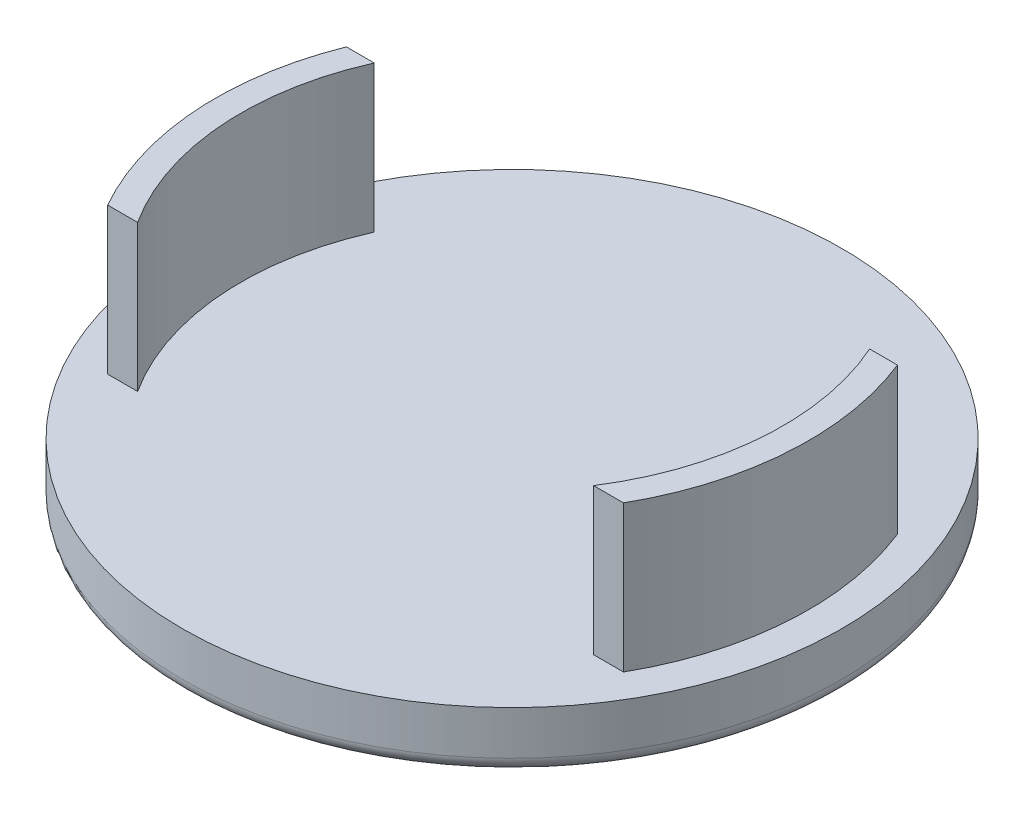
ISO-10303-21;
HEADER;
FILE_DESCRIPTION(('STEP AP214'),'2;1');
FILE_NAME('part.step','',(''),(''),'','','');
FILE_SCHEMA(('AUTOMOTIVE_DESIGN { 1 0 10303 214 1 1 1 1 }'));
ENDSEC;
DATA;
#1=APPLICATION_CONTEXT('core data for automotive mechanical design processes');
#2=APPLICATION_PROTOCOL_DEFINITION('international standard','automotive_design',2000,#1);
#3=PRODUCT_CONTEXT('',#1,'mechanical');
#4=PRODUCT('Part','Part','',(#3));
#5=PRODUCT_RELATED_PRODUCT_CATEGORY('part','',(#4));
#6=PRODUCT_DEFINITION_FORMATION('','',#4);
#7=PRODUCT_DEFINITION_CONTEXT('part definition',#1,'design');
#8=PRODUCT_DEFINITION('design','',#6,#7);
#9=PRODUCT_DEFINITION_SHAPE('','',#8);
#10=(LENGTH_UNIT() NAMED_UNIT(*) SI_UNIT(.MILLI.,.METRE.));
#11=(NAMED_UNIT(*) PLANE_ANGLE_UNIT() SI_UNIT($,.RADIAN.));
#12=(NAMED_UNIT(*) SI_UNIT($,.STERADIAN.) SOLID_ANGLE_UNIT());
#13=UNCERTAINTY_MEASURE_WITH_UNIT(LENGTH_MEASURE(1.E-05),#10,'distance_accuracy_value','');
#14=(GEOMETRIC_REPRESENTATION_CONTEXT(3) GLOBAL_UNCERTAINTY_ASSIGNED_CONTEXT((#13)) GLOBAL_UNIT_ASSIGNED_CONTEXT((#10,
#11,#12)) REPRESENTATION_CONTEXT('',''));
#15=CARTESIAN_POINT('',(0.,0.,0.));
#16=DIRECTION('',(0.,0.,1.));
#17=DIRECTION('',(1.,0.,0.));
#18=AXIS2_PLACEMENT_3D('',#15,#16,#17);
#19=CARTESIAN_POINT('',(0.,14.,0.));
#20=DIRECTION('',(0.,1.,0.));
#21=DIRECTION('',(0.,0.,1.));
#22=AXIS2_PLACEMENT_3D('',#19,#20,#21);
#23=PLANE('',#22);
#24=DIRECTION('',(1.,0.,0.));
#25=VECTOR('',#24,1.);
#26=CARTESIAN_POINT('',(-24.1851152798793,14.,-7.5));
#27=LINE('',#26,#25);
#28=CARTESIAN_POINT('',(-18.8099043059767,14.,-7.5));
#29=VERTEX_POINT('',#28);
#30=CARTESIAN_POINT('',(-16.9115345252878,14.,-7.5));
#31=VERTEX_POINT('',#30);
#32=EDGE_CURVE('E210',#29,#31,#27,.T.);
#33=ORIENTED_EDGE('',*,*,#32,.F.);
#34=CARTESIAN_POINT('',(0.,14.,0.));
#35=DIRECTION('',(0.,1.,0.));
#36=DIRECTION('',(0.,0.,1.));
#37=AXIS2_PLACEMENT_3D('',#34,#35,#36);
#38=CIRCLE('',#37,20.25);
#39=CARTESIAN_POINT('',(-17.6085916529403,14.,10.));
#40=VERTEX_POINT('',#39);
#41=EDGE_CURVE('E133',#29,#40,#38,.T.);
#42=ORIENTED_EDGE('',*,*,#41,.T.);
#43=DIRECTION('',(-1.,0.,0.));
#44=VECTOR('',#43,1.);
#45=CARTESIAN_POINT('',(-21.2125444705935,14.,10.));
#46=LINE('',#45,#44);
#47=CARTESIAN_POINT('',(-15.5643824162734,14.,10.));
#48=VERTEX_POINT('',#47);
#49=EDGE_CURVE('E127',#48,#40,#46,.T.);
#50=ORIENTED_EDGE('',*,*,#49,.F.);
#51=CARTESIAN_POINT('',(0.,14.,0.));
#52=DIRECTION('',(0.,1.,0.));
#53=DIRECTION('',(0.,0.,1.));
#54=AXIS2_PLACEMENT_3D('',#51,#52,#53);
#55=CIRCLE('',#54,18.5);
#56=EDGE_CURVE('E226',#31,#48,#55,.T.);
#57=ORIENTED_EDGE('',*,*,#56,.F.);
#58=EDGE_LOOP('',(#33,#42,#50,#57));
#59=FACE_BOUND('',#58,.T.);
#60=ADVANCED_FACE('F41',(#59),#23,.T.);
#61=CARTESIAN_POINT('',(0.,14.,0.));
#62=DIRECTION('',(0.,-1.,0.));
#63=DIRECTION('',(0.,0.,-1.));
#64=AXIS2_PLACEMENT_3D('',#61,#62,#63);
#65=CYLINDRICAL_SURFACE('',#64,20.25);
#66=ORIENTED_EDGE('',*,*,#41,.F.);
#67=DIRECTION('',(0.,-1.,0.));
#68=VECTOR('',#67,1.);
#69=CARTESIAN_POINT('',(-18.8099043059767,14.,-7.5));
#70=LINE('',#69,#68);
#71=CARTESIAN_POINT('',(-18.8099043059767,4.,-7.5));
#72=VERTEX_POINT('',#71);
#73=EDGE_CURVE('E224',#29,#72,#70,.T.);
#74=ORIENTED_EDGE('',*,*,#73,.T.);
#75=CARTESIAN_POINT('',(0.,4.,0.));
#76=DIRECTION('',(0.,1.,0.));
#77=DIRECTION('',(0.,0.,1.));
#78=AXIS2_PLACEMENT_3D('',#75,#76,#77);
#79=CIRCLE('',#78,20.25);
#80=CARTESIAN_POINT('',(-17.6085916529403,4.,10.));
#81=VERTEX_POINT('',#80);
#82=EDGE_CURVE('E143',#72,#81,#79,.T.);
#83=ORIENTED_EDGE('',*,*,#82,.T.);
#84=DIRECTION('',(0.,-1.,0.));
#85=VECTOR('',#84,1.);
#86=CARTESIAN_POINT('',(-17.6085916529403,14.,10.));
#87=LINE('',#86,#85);
#88=EDGE_CURVE('E116',#81,#40,#87,.F.);
#89=ORIENTED_EDGE('',*,*,#88,.T.);
#90=EDGE_LOOP('',(#66,#74,#83,#89));
#91=FACE_BOUND('',#90,.T.);
#92=ADVANCED_FACE('F165',(#91),#65,.T.);
#93=CARTESIAN_POINT('',(0.,14.,0.));
#94=DIRECTION('',(0.,-1.,0.));
#95=DIRECTION('',(0.,0.,-1.));
#96=AXIS2_PLACEMENT_3D('',#93,#94,#95);
#97=CYLINDRICAL_SURFACE('',#96,18.5);
#98=DIRECTION('',(0.,-1.,0.));
#99=VECTOR('',#98,1.);
#100=CARTESIAN_POINT('',(-16.9115345252878,14.,-7.5));
#101=LINE('',#100,#99);
#102=CARTESIAN_POINT('',(-16.9115345252878,4.,-7.5));
#103=VERTEX_POINT('',#102);
#104=EDGE_CURVE('E206',#31,#103,#101,.T.);
#105=ORIENTED_EDGE('',*,*,#104,.F.);
#106=ORIENTED_EDGE('',*,*,#56,.T.);
#107=DIRECTION('',(0.,-1.,0.));
#108=VECTOR('',#107,1.);
#109=CARTESIAN_POINT('',(-15.5643824162734,14.,10.));
#110=LINE('',#109,#108);
#111=CARTESIAN_POINT('',(-15.5643824162734,4.,10.));
#112=VERTEX_POINT('',#111);
#113=EDGE_CURVE('E212',#112,#48,#110,.F.);
#114=ORIENTED_EDGE('',*,*,#113,.F.);
#115=CARTESIAN_POINT('',(0.,4.,0.));
#116=DIRECTION('',(0.,1.,0.));
#117=DIRECTION('',(0.,0.,1.));
#118=AXIS2_PLACEMENT_3D('',#115,#116,#117);
#119=CIRCLE('',#118,18.5);
#120=EDGE_CURVE('E145',#112,#103,#119,.F.);
#121=ORIENTED_EDGE('',*,*,#120,.T.);
#122=EDGE_LOOP('',(#105,#106,#114,#121));
#123=FACE_BOUND('',#122,.T.);
#124=ADVANCED_FACE('F171',(#123),#97,.F.);
#125=CARTESIAN_POINT('',(0.,4.,0.));
#126=DIRECTION('',(0.,-1.,0.));
#127=DIRECTION('',(0.,0.,-1.));
#128=AXIS2_PLACEMENT_3D('',#125,#126,#127);
#129=CYLINDRICAL_SURFACE('',#128,22.5);
#130=CARTESIAN_POINT('',(0.,1.,0.));
#131=DIRECTION('',(0.,1.,0.));
#132=DIRECTION('',(0.,0.,1.));
#133=AXIS2_PLACEMENT_3D('',#130,#131,#132);
#134=CIRCLE('',#133,22.5);
#135=CARTESIAN_POINT('',(0.,1.,22.5));
#136=VERTEX_POINT('',#135);
#137=EDGE_CURVE('E49',#136,#136,#134,.T.);
#138=ORIENTED_EDGE('',*,*,#137,.T.);
#139=EDGE_LOOP('',(#138));
#140=FACE_BOUND('',#139,.T.);
#141=CARTESIAN_POINT('',(0.,4.,0.));
#142=DIRECTION('',(0.,1.,0.));
#143=DIRECTION('',(0.,0.,1.));
#144=AXIS2_PLACEMENT_3D('',#141,#142,#143);
#145=CIRCLE('',#144,22.5);
#146=CARTESIAN_POINT('',(0.,4.,22.5));
#147=VERTEX_POINT('',#146);
#148=EDGE_CURVE('E132',#147,#147,#145,.T.);
#149=ORIENTED_EDGE('',*,*,#148,.F.);
#150=EDGE_LOOP('',(#149));
#151=FACE_BOUND('',#150,.T.);
#152=ADVANCED_FACE('F150',(#140,#151),#129,.T.);
#153=CARTESIAN_POINT('',(0.,4.,0.));
#154=DIRECTION('',(0.,1.,0.));
#155=DIRECTION('',(0.,0.,1.));
#156=AXIS2_PLACEMENT_3D('',#153,#154,#155);
#157=PLANE('',#156);
#158=ORIENTED_EDGE('',*,*,#82,.F.);
#159=DIRECTION('',(1.,0.,0.));
#160=VECTOR('',#159,1.);
#161=CARTESIAN_POINT('',(-24.1851152798793,4.,-7.5));
#162=LINE('',#161,#160);
#163=EDGE_CURVE('E64',#72,#103,#162,.T.);
#164=ORIENTED_EDGE('',*,*,#163,.T.);
#165=ORIENTED_EDGE('',*,*,#120,.F.);
#166=DIRECTION('',(-1.,0.,0.));
#167=VECTOR('',#166,1.);
#168=CARTESIAN_POINT('',(-21.2125444705935,4.,10.));
#169=LINE('',#168,#167);
#170=EDGE_CURVE('E215',#112,#81,#169,.T.);
#171=ORIENTED_EDGE('',*,*,#170,.T.);
#172=EDGE_LOOP('',(#158,#164,#165,#171));
#173=FACE_BOUND('',#172,.T.);
#174=ORIENTED_EDGE('',*,*,#148,.T.);
#175=EDGE_LOOP('',(#174));
#176=FACE_BOUND('',#175,.T.);
#177=CARTESIAN_POINT('',(17.6085916529403,4.,10.));
#178=VERTEX_POINT('',#177);
#179=CARTESIAN_POINT('',(18.8099043059767,4.,-7.5));
#180=VERTEX_POINT('',#179);
#181=EDGE_CURVE('E139',#178,#180,#79,.T.);
#182=ORIENTED_EDGE('',*,*,#181,.F.);
#183=CARTESIAN_POINT('',(15.5643824162734,4.,10.));
#184=VERTEX_POINT('',#183);
#185=EDGE_CURVE('E56',#178,#184,#169,.T.);
#186=ORIENTED_EDGE('',*,*,#185,.T.);
#187=CARTESIAN_POINT('',(16.9115345252878,4.,-7.5));
#188=VERTEX_POINT('',#187);
#189=EDGE_CURVE('E136',#188,#184,#119,.F.);
#190=ORIENTED_EDGE('',*,*,#189,.F.);
#191=EDGE_CURVE('E209',#188,#180,#162,.T.);
#192=ORIENTED_EDGE('',*,*,#191,.T.);
#193=EDGE_LOOP('',(#182,#186,#190,#192));
#194=FACE_BOUND('',#193,.T.);
#195=ADVANCED_FACE('F183',(#173,#176,#194),#157,.T.);
#196=CARTESIAN_POINT('',(0.,0.,0.));
#197=DIRECTION('',(0.,1.,0.));
#198=DIRECTION('',(0.,0.,1.));
#199=AXIS2_PLACEMENT_3D('',#196,#197,#198);
#200=PLANE('',#199);
#201=CARTESIAN_POINT('',(0.,0.,0.));
#202=DIRECTION('',(0.,1.,0.));
#203=DIRECTION('',(0.,0.,1.));
#204=AXIS2_PLACEMENT_3D('',#201,#202,#203);
#205=CIRCLE('',#204,21.5);
#206=CARTESIAN_POINT('',(0.,0.,21.5));
#207=VERTEX_POINT('',#206);
#208=EDGE_CURVE('E11',#207,#207,#205,.F.);
#209=ORIENTED_EDGE('',*,*,#208,.T.);
#210=EDGE_LOOP('',(#209));
#211=FACE_BOUND('',#210,.T.);
#212=ADVANCED_FACE('F177',(#211),#200,.F.);
#213=CARTESIAN_POINT('',(16.9115345252878,14.,-7.5));
#214=VERTEX_POINT('',#213);
#215=CARTESIAN_POINT('',(18.8099043059767,14.,-7.5));
#216=VERTEX_POINT('',#215);
#217=EDGE_CURVE('E126',#214,#216,#27,.T.);
#218=ORIENTED_EDGE('',*,*,#217,.F.);
#219=CARTESIAN_POINT('',(15.5643824162734,14.,10.));
#220=VERTEX_POINT('',#219);
#221=EDGE_CURVE('E125',#220,#214,#55,.T.);
#222=ORIENTED_EDGE('',*,*,#221,.F.);
#223=CARTESIAN_POINT('',(17.6085916529403,14.,10.));
#224=VERTEX_POINT('',#223);
#225=EDGE_CURVE('E110',#224,#220,#46,.T.);
#226=ORIENTED_EDGE('',*,*,#225,.F.);
#227=EDGE_CURVE('E123',#224,#216,#38,.T.);
#228=ORIENTED_EDGE('',*,*,#227,.T.);
#229=EDGE_LOOP('',(#218,#222,#226,#228));
#230=FACE_BOUND('',#229,.T.);
#231=ADVANCED_FACE('F122',(#230),#23,.T.);
#232=ORIENTED_EDGE('',*,*,#181,.T.);
#233=DIRECTION('',(0.,-1.,0.));
#234=VECTOR('',#233,1.);
#235=CARTESIAN_POINT('',(18.8099043059767,14.,-7.5));
#236=LINE('',#235,#234);
#237=EDGE_CURVE('E131',#180,#216,#236,.F.);
#238=ORIENTED_EDGE('',*,*,#237,.T.);
#239=ORIENTED_EDGE('',*,*,#227,.F.);
#240=DIRECTION('',(0.,-1.,0.));
#241=VECTOR('',#240,1.);
#242=CARTESIAN_POINT('',(17.6085916529403,14.,10.));
#243=LINE('',#242,#241);
#244=EDGE_CURVE('E107',#224,#178,#243,.T.);
#245=ORIENTED_EDGE('',*,*,#244,.T.);
#246=EDGE_LOOP('',(#232,#238,#239,#245));
#247=FACE_BOUND('',#246,.T.);
#248=ADVANCED_FACE('F130',(#247),#65,.T.);
#249=DIRECTION('',(0.,-1.,0.));
#250=VECTOR('',#249,1.);
#251=CARTESIAN_POINT('',(16.9115345252878,14.,-7.5));
#252=LINE('',#251,#250);
#253=EDGE_CURVE('E115',#188,#214,#252,.F.);
#254=ORIENTED_EDGE('',*,*,#253,.F.);
#255=ORIENTED_EDGE('',*,*,#189,.T.);
#256=DIRECTION('',(0.,-1.,0.));
#257=VECTOR('',#256,1.);
#258=CARTESIAN_POINT('',(15.5643824162734,14.,10.));
#259=LINE('',#258,#257);
#260=EDGE_CURVE('E219',#220,#184,#259,.T.);
#261=ORIENTED_EDGE('',*,*,#260,.F.);
#262=ORIENTED_EDGE('',*,*,#221,.T.);
#263=EDGE_LOOP('',(#254,#255,#261,#262));
#264=FACE_BOUND('',#263,.T.);
#265=ADVANCED_FACE('F182',(#264),#97,.F.);
#266=CARTESIAN_POINT('',(-21.2125444705935,4.,10.));
#267=DIRECTION('',(0.,0.,-1.));
#268=DIRECTION('',(-1.,0.,0.));
#269=AXIS2_PLACEMENT_3D('',#266,#267,#268);
#270=PLANE('',#269);
#271=ORIENTED_EDGE('',*,*,#225,.T.);
#272=ORIENTED_EDGE('',*,*,#260,.T.);
#273=ORIENTED_EDGE('',*,*,#185,.F.);
#274=ORIENTED_EDGE('',*,*,#244,.F.);
#275=EDGE_LOOP('',(#271,#272,#273,#274));
#276=FACE_BOUND('',#275,.T.);
#277=ADVANCED_FACE('F109',(#276),#270,.F.);
#278=ORIENTED_EDGE('',*,*,#170,.F.);
#279=ORIENTED_EDGE('',*,*,#113,.T.);
#280=ORIENTED_EDGE('',*,*,#49,.T.);
#281=ORIENTED_EDGE('',*,*,#88,.F.);
#282=EDGE_LOOP('',(#278,#279,#280,#281));
#283=FACE_BOUND('',#282,.T.);
#284=ADVANCED_FACE('F203',(#283),#270,.F.);
#285=CARTESIAN_POINT('',(-24.1851152798793,4.,-7.5));
#286=DIRECTION('',(0.,0.,1.));
#287=DIRECTION('',(1.,0.,0.));
#288=AXIS2_PLACEMENT_3D('',#285,#286,#287);
#289=PLANE('',#288);
#290=ORIENTED_EDGE('',*,*,#32,.T.);
#291=ORIENTED_EDGE('',*,*,#104,.T.);
#292=ORIENTED_EDGE('',*,*,#163,.F.);
#293=ORIENTED_EDGE('',*,*,#73,.F.);
#294=EDGE_LOOP('',(#290,#291,#292,#293));
#295=FACE_BOUND('',#294,.T.);
#296=ADVANCED_FACE('F160',(#295),#289,.F.);
#297=ORIENTED_EDGE('',*,*,#191,.F.);
#298=ORIENTED_EDGE('',*,*,#253,.T.);
#299=ORIENTED_EDGE('',*,*,#217,.T.);
#300=ORIENTED_EDGE('',*,*,#237,.F.);
#301=EDGE_LOOP('',(#297,#298,#299,#300));
#302=FACE_BOUND('',#301,.T.);
#303=ADVANCED_FACE('F154',(#302),#289,.F.);
#304=CARTESIAN_POINT('',(0.,1.,0.));
#305=DIRECTION('',(0.,1.,0.));
#306=DIRECTION('',(0.,0.,1.));
#307=AXIS2_PLACEMENT_3D('',#304,#305,#306);
#308=TOROIDAL_SURFACE('',#307,21.5,1.);
#309=ORIENTED_EDGE('',*,*,#208,.F.);
#310=EDGE_LOOP('',(#309));
#311=FACE_BOUND('',#310,.T.);
#312=ORIENTED_EDGE('',*,*,#137,.F.);
#313=EDGE_LOOP('',(#312));
#314=FACE_BOUND('',#313,.T.);
#315=ADVANCED_FACE('F43',(#311,#314),#308,.T.);
#316=CLOSED_SHELL('',(#60,#92,#124,#152,#195,#212,#231,#248,#265,#277,#284,#296,#303,#315));
#317=MANIFOLD_SOLID_BREP('B2',#316);
#318=ADVANCED_BREP_SHAPE_REPRESENTATION('',(#18,#317),#14);
#319=SHAPE_DEFINITION_REPRESENTATION(#9,#318);
ENDSEC;
END-ISO-10303-21;
